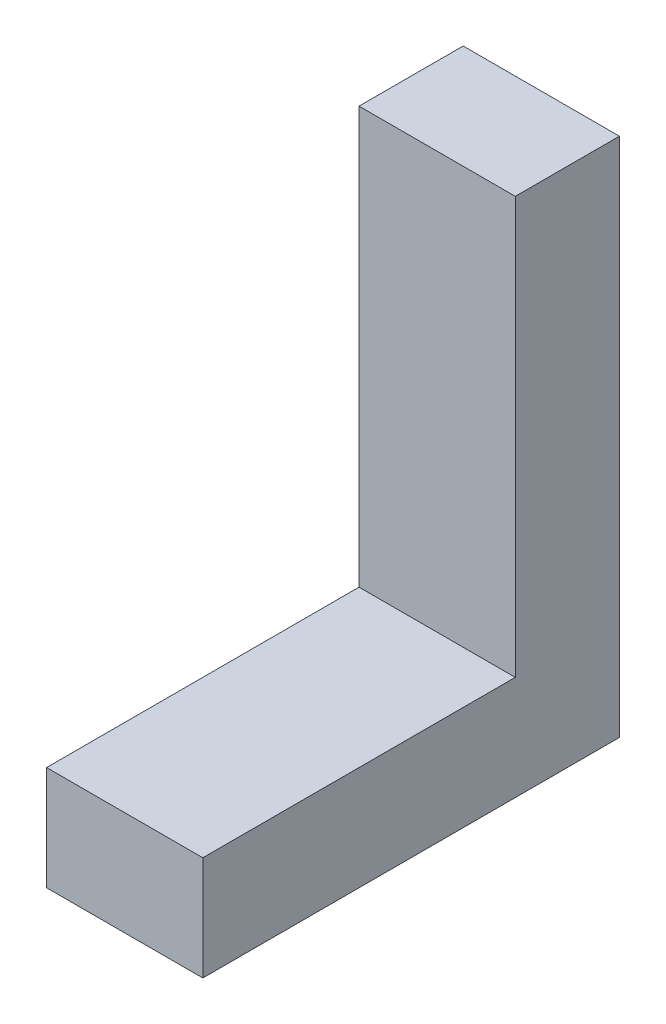
ISO-10303-21;
HEADER;
FILE_DESCRIPTION(('STEP AP214'),'2;1');
FILE_NAME('part.step','',(''),(''),'','','');
FILE_SCHEMA(('AUTOMOTIVE_DESIGN { 1 0 10303 214 1 1 1 1 }'));
ENDSEC;
DATA;
#1=APPLICATION_CONTEXT('core data for automotive mechanical design processes');
#2=APPLICATION_PROTOCOL_DEFINITION('international standard','automotive_design',2000,#1);
#3=PRODUCT_CONTEXT('',#1,'mechanical');
#4=PRODUCT('Part','Part','',(#3));
#5=PRODUCT_RELATED_PRODUCT_CATEGORY('part','',(#4));
#6=PRODUCT_DEFINITION_FORMATION('','',#4);
#7=PRODUCT_DEFINITION_CONTEXT('part definition',#1,'design');
#8=PRODUCT_DEFINITION('design','',#6,#7);
#9=PRODUCT_DEFINITION_SHAPE('','',#8);
#10=(LENGTH_UNIT() NAMED_UNIT(*) SI_UNIT(.MILLI.,.METRE.));
#11=(NAMED_UNIT(*) PLANE_ANGLE_UNIT() SI_UNIT($,.RADIAN.));
#12=(NAMED_UNIT(*) SI_UNIT($,.STERADIAN.) SOLID_ANGLE_UNIT());
#13=UNCERTAINTY_MEASURE_WITH_UNIT(LENGTH_MEASURE(1.E-05),#10,'distance_accuracy_value','');
#14=(GEOMETRIC_REPRESENTATION_CONTEXT(3) GLOBAL_UNCERTAINTY_ASSIGNED_CONTEXT((#13)) GLOBAL_UNIT_ASSIGNED_CONTEXT((#10,
#11,#12)) REPRESENTATION_CONTEXT('',''));
#15=CARTESIAN_POINT('',(0.,0.,0.));
#16=DIRECTION('',(0.,0.,1.));
#17=DIRECTION('',(1.,0.,0.));
#18=AXIS2_PLACEMENT_3D('',#15,#16,#17);
#19=CARTESIAN_POINT('',(15.,50.,0.));
#20=DIRECTION('',(0.,0.,1.));
#21=DIRECTION('',(1.,0.,0.));
#22=AXIS2_PLACEMENT_3D('',#19,#20,#21);
#23=PLANE('',#22);
#24=DIRECTION('',(0.,1.,0.));
#25=VECTOR('',#24,1.);
#26=CARTESIAN_POINT('',(0.,50.,0.));
#27=LINE('',#26,#25);
#28=CARTESIAN_POINT('',(0.,0.,0.));
#29=VERTEX_POINT('',#28);
#30=CARTESIAN_POINT('',(0.,50.,0.));
#31=VERTEX_POINT('',#30);
#32=EDGE_CURVE('E125',#29,#31,#27,.T.);
#33=ORIENTED_EDGE('',*,*,#32,.T.);
#34=DIRECTION('',(-1.,0.,0.));
#35=VECTOR('',#34,1.);
#36=CARTESIAN_POINT('',(15.,50.,0.));
#37=LINE('',#36,#35);
#38=CARTESIAN_POINT('',(15.,50.,0.));
#39=VERTEX_POINT('',#38);
#40=EDGE_CURVE('E11',#39,#31,#37,.T.);
#41=ORIENTED_EDGE('',*,*,#40,.F.);
#42=DIRECTION('',(0.,1.,0.));
#43=VECTOR('',#42,1.);
#44=CARTESIAN_POINT('',(15.,50.,0.));
#45=LINE('',#44,#43);
#46=CARTESIAN_POINT('',(15.,0.,0.));
#47=VERTEX_POINT('',#46);
#48=EDGE_CURVE('E132',#47,#39,#45,.T.);
#49=ORIENTED_EDGE('',*,*,#48,.F.);
#50=DIRECTION('',(-1.,0.,0.));
#51=VECTOR('',#50,1.);
#52=CARTESIAN_POINT('',(15.,0.,0.));
#53=LINE('',#52,#51);
#54=EDGE_CURVE('E118',#47,#29,#53,.T.);
#55=ORIENTED_EDGE('',*,*,#54,.T.);
#56=EDGE_LOOP('',(#33,#41,#49,#55));
#57=FACE_BOUND('',#56,.T.);
#58=ADVANCED_FACE('F39',(#57),#23,.F.);
#59=CARTESIAN_POINT('',(15.,50.,10.));
#60=DIRECTION('',(0.,-1.,0.));
#61=DIRECTION('',(0.,0.,-1.));
#62=AXIS2_PLACEMENT_3D('',#59,#60,#61);
#63=PLANE('',#62);
#64=DIRECTION('',(0.,0.,1.));
#65=VECTOR('',#64,1.);
#66=CARTESIAN_POINT('',(0.,50.,10.));
#67=LINE('',#66,#65);
#68=CARTESIAN_POINT('',(0.,50.,10.));
#69=VERTEX_POINT('',#68);
#70=EDGE_CURVE('E127',#31,#69,#67,.T.);
#71=ORIENTED_EDGE('',*,*,#70,.T.);
#72=DIRECTION('',(-1.,0.,0.));
#73=VECTOR('',#72,1.);
#74=CARTESIAN_POINT('',(15.,50.,10.));
#75=LINE('',#74,#73);
#76=CARTESIAN_POINT('',(15.,50.,10.));
#77=VERTEX_POINT('',#76);
#78=EDGE_CURVE('E50',#77,#69,#75,.T.);
#79=ORIENTED_EDGE('',*,*,#78,.F.);
#80=DIRECTION('',(0.,0.,1.));
#81=VECTOR('',#80,1.);
#82=CARTESIAN_POINT('',(15.,50.,10.));
#83=LINE('',#82,#81);
#84=EDGE_CURVE('E95',#39,#77,#83,.T.);
#85=ORIENTED_EDGE('',*,*,#84,.F.);
#86=ORIENTED_EDGE('',*,*,#40,.T.);
#87=EDGE_LOOP('',(#71,#79,#85,#86));
#88=FACE_BOUND('',#87,.T.);
#89=ADVANCED_FACE('F160',(#88),#63,.F.);
#90=CARTESIAN_POINT('',(15.,10.,10.));
#91=DIRECTION('',(0.,0.,-1.));
#92=DIRECTION('',(-1.,0.,0.));
#93=AXIS2_PLACEMENT_3D('',#90,#91,#92);
#94=PLANE('',#93);
#95=DIRECTION('',(0.,-1.,0.));
#96=VECTOR('',#95,1.);
#97=CARTESIAN_POINT('',(0.,10.,10.));
#98=LINE('',#97,#96);
#99=CARTESIAN_POINT('',(0.,10.,10.));
#100=VERTEX_POINT('',#99);
#101=EDGE_CURVE('E126',#69,#100,#98,.T.);
#102=ORIENTED_EDGE('',*,*,#101,.T.);
#103=DIRECTION('',(-1.,0.,0.));
#104=VECTOR('',#103,1.);
#105=CARTESIAN_POINT('',(15.,10.,10.));
#106=LINE('',#105,#104);
#107=CARTESIAN_POINT('',(15.,10.,10.));
#108=VERTEX_POINT('',#107);
#109=EDGE_CURVE('E111',#108,#100,#106,.T.);
#110=ORIENTED_EDGE('',*,*,#109,.F.);
#111=DIRECTION('',(0.,-1.,0.));
#112=VECTOR('',#111,1.);
#113=CARTESIAN_POINT('',(15.,10.,10.));
#114=LINE('',#113,#112);
#115=EDGE_CURVE('E104',#77,#108,#114,.T.);
#116=ORIENTED_EDGE('',*,*,#115,.F.);
#117=ORIENTED_EDGE('',*,*,#78,.T.);
#118=EDGE_LOOP('',(#102,#110,#116,#117));
#119=FACE_BOUND('',#118,.T.);
#120=ADVANCED_FACE('F136',(#119),#94,.F.);
#121=CARTESIAN_POINT('',(15.,10.,40.));
#122=DIRECTION('',(0.,-1.,0.));
#123=DIRECTION('',(0.,0.,-1.));
#124=AXIS2_PLACEMENT_3D('',#121,#122,#123);
#125=PLANE('',#124);
#126=DIRECTION('',(0.,0.,1.));
#127=VECTOR('',#126,1.);
#128=CARTESIAN_POINT('',(0.,10.,40.));
#129=LINE('',#128,#127);
#130=CARTESIAN_POINT('',(0.,10.,40.));
#131=VERTEX_POINT('',#130);
#132=EDGE_CURVE('E114',#100,#131,#129,.T.);
#133=ORIENTED_EDGE('',*,*,#132,.T.);
#134=DIRECTION('',(-1.,0.,0.));
#135=VECTOR('',#134,1.);
#136=CARTESIAN_POINT('',(15.,10.,40.));
#137=LINE('',#136,#135);
#138=CARTESIAN_POINT('',(15.,10.,40.));
#139=VERTEX_POINT('',#138);
#140=EDGE_CURVE('E109',#139,#131,#137,.T.);
#141=ORIENTED_EDGE('',*,*,#140,.F.);
#142=DIRECTION('',(0.,0.,1.));
#143=VECTOR('',#142,1.);
#144=CARTESIAN_POINT('',(15.,10.,40.));
#145=LINE('',#144,#143);
#146=EDGE_CURVE('E97',#108,#139,#145,.T.);
#147=ORIENTED_EDGE('',*,*,#146,.F.);
#148=ORIENTED_EDGE('',*,*,#109,.T.);
#149=EDGE_LOOP('',(#133,#141,#147,#148));
#150=FACE_BOUND('',#149,.T.);
#151=ADVANCED_FACE('F112',(#150),#125,.F.);
#152=CARTESIAN_POINT('',(15.,0.,40.));
#153=DIRECTION('',(0.,0.,-1.));
#154=DIRECTION('',(-1.,0.,0.));
#155=AXIS2_PLACEMENT_3D('',#152,#153,#154);
#156=PLANE('',#155);
#157=DIRECTION('',(0.,-1.,0.));
#158=VECTOR('',#157,1.);
#159=CARTESIAN_POINT('',(0.,0.,40.));
#160=LINE('',#159,#158);
#161=CARTESIAN_POINT('',(0.,0.,40.));
#162=VERTEX_POINT('',#161);
#163=EDGE_CURVE('E77',#131,#162,#160,.T.);
#164=ORIENTED_EDGE('',*,*,#163,.T.);
#165=DIRECTION('',(-1.,0.,0.));
#166=VECTOR('',#165,1.);
#167=CARTESIAN_POINT('',(15.,0.,40.));
#168=LINE('',#167,#166);
#169=CARTESIAN_POINT('',(15.,0.,40.));
#170=VERTEX_POINT('',#169);
#171=EDGE_CURVE('E113',#170,#162,#168,.T.);
#172=ORIENTED_EDGE('',*,*,#171,.F.);
#173=DIRECTION('',(0.,-1.,0.));
#174=VECTOR('',#173,1.);
#175=CARTESIAN_POINT('',(15.,0.,40.));
#176=LINE('',#175,#174);
#177=EDGE_CURVE('E103',#139,#170,#176,.T.);
#178=ORIENTED_EDGE('',*,*,#177,.F.);
#179=ORIENTED_EDGE('',*,*,#140,.T.);
#180=EDGE_LOOP('',(#164,#172,#178,#179));
#181=FACE_BOUND('',#180,.T.);
#182=ADVANCED_FACE('F120',(#181),#156,.F.);
#183=CARTESIAN_POINT('',(15.,0.,0.));
#184=DIRECTION('',(0.,1.,0.));
#185=DIRECTION('',(0.,0.,1.));
#186=AXIS2_PLACEMENT_3D('',#183,#184,#185);
#187=PLANE('',#186);
#188=DIRECTION('',(0.,0.,-1.));
#189=VECTOR('',#188,1.);
#190=CARTESIAN_POINT('',(0.,0.,0.));
#191=LINE('',#190,#189);
#192=EDGE_CURVE('E81',#162,#29,#191,.T.);
#193=ORIENTED_EDGE('',*,*,#192,.T.);
#194=ORIENTED_EDGE('',*,*,#54,.F.);
#195=DIRECTION('',(0.,0.,-1.));
#196=VECTOR('',#195,1.);
#197=CARTESIAN_POINT('',(15.,0.,0.));
#198=LINE('',#197,#196);
#199=EDGE_CURVE('E54',#170,#47,#198,.T.);
#200=ORIENTED_EDGE('',*,*,#199,.F.);
#201=ORIENTED_EDGE('',*,*,#171,.T.);
#202=EDGE_LOOP('',(#193,#194,#200,#201));
#203=FACE_BOUND('',#202,.T.);
#204=ADVANCED_FACE('F148',(#203),#187,.F.);
#205=CARTESIAN_POINT('',(15.,0.,0.));
#206=DIRECTION('',(-1.,0.,0.));
#207=DIRECTION('',(0.,0.,1.));
#208=AXIS2_PLACEMENT_3D('',#205,#206,#207);
#209=PLANE('',#208);
#210=ORIENTED_EDGE('',*,*,#48,.T.);
#211=ORIENTED_EDGE('',*,*,#84,.T.);
#212=ORIENTED_EDGE('',*,*,#115,.T.);
#213=ORIENTED_EDGE('',*,*,#146,.T.);
#214=ORIENTED_EDGE('',*,*,#177,.T.);
#215=ORIENTED_EDGE('',*,*,#199,.T.);
#216=EDGE_LOOP('',(#210,#211,#212,#213,#214,#215));
#217=FACE_BOUND('',#216,.T.);
#218=ADVANCED_FACE('F101',(#217),#209,.F.);
#219=CARTESIAN_POINT('',(0.,0.,0.));
#220=DIRECTION('',(-1.,0.,0.));
#221=DIRECTION('',(0.,0.,1.));
#222=AXIS2_PLACEMENT_3D('',#219,#220,#221);
#223=PLANE('',#222);
#224=ORIENTED_EDGE('',*,*,#32,.F.);
#225=ORIENTED_EDGE('',*,*,#192,.F.);
#226=ORIENTED_EDGE('',*,*,#163,.F.);
#227=ORIENTED_EDGE('',*,*,#132,.F.);
#228=ORIENTED_EDGE('',*,*,#101,.F.);
#229=ORIENTED_EDGE('',*,*,#70,.F.);
#230=EDGE_LOOP('',(#224,#225,#226,#227,#228,#229));
#231=FACE_BOUND('',#230,.T.);
#232=ADVANCED_FACE('F142',(#231),#223,.T.);
#233=CLOSED_SHELL('',(#58,#89,#120,#151,#182,#204,#218,#232));
#234=MANIFOLD_SOLID_BREP('B2',#233);
#235=ADVANCED_BREP_SHAPE_REPRESENTATION('',(#18,#234),#14);
#236=SHAPE_DEFINITION_REPRESENTATION(#9,#235);
ENDSEC;
END-ISO-10303-21;
